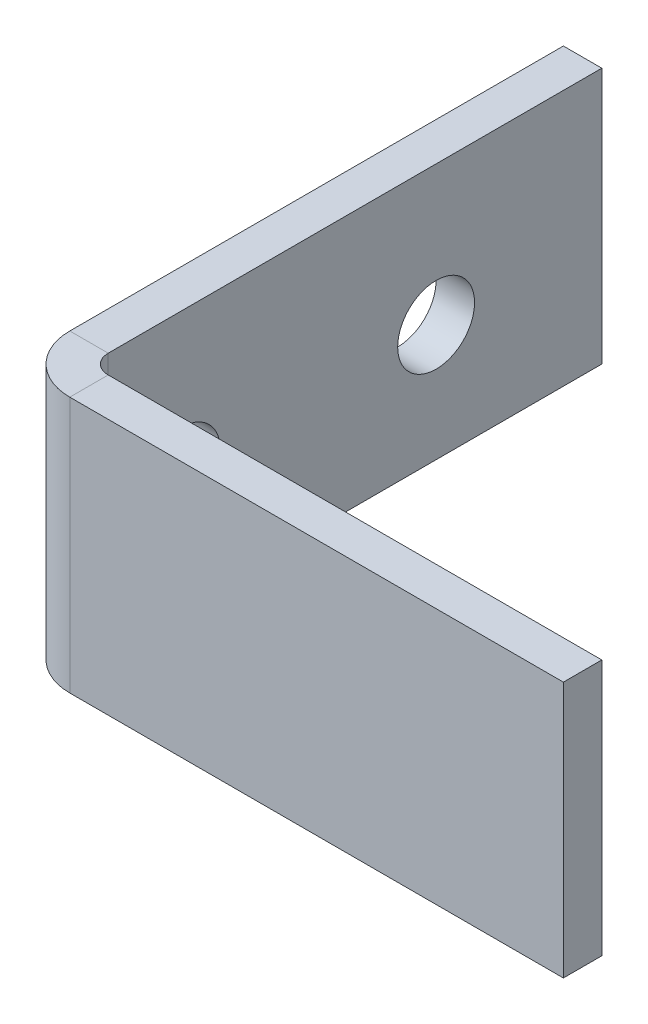
ISO-10303-21;
HEADER;
FILE_DESCRIPTION(('STEP AP214'),'2;1');
FILE_NAME('part.step','',(''),(''),'','','');
FILE_SCHEMA(('AUTOMOTIVE_DESIGN { 1 0 10303 214 1 1 1 1 }'));
ENDSEC;
DATA;
#1=APPLICATION_CONTEXT('core data for automotive mechanical design processes');
#2=APPLICATION_PROTOCOL_DEFINITION('international standard','automotive_design',2000,#1);
#3=PRODUCT_CONTEXT('',#1,'mechanical');
#4=PRODUCT('Part','Part','',(#3));
#5=PRODUCT_RELATED_PRODUCT_CATEGORY('part','',(#4));
#6=PRODUCT_DEFINITION_FORMATION('','',#4);
#7=PRODUCT_DEFINITION_CONTEXT('part definition',#1,'design');
#8=PRODUCT_DEFINITION('design','',#6,#7);
#9=PRODUCT_DEFINITION_SHAPE('','',#8);
#10=(LENGTH_UNIT() NAMED_UNIT(*) SI_UNIT(.MILLI.,.METRE.));
#11=(NAMED_UNIT(*) PLANE_ANGLE_UNIT() SI_UNIT($,.RADIAN.));
#12=(NAMED_UNIT(*) SI_UNIT($,.STERADIAN.) SOLID_ANGLE_UNIT());
#13=UNCERTAINTY_MEASURE_WITH_UNIT(LENGTH_MEASURE(1.E-05),#10,'distance_accuracy_value','');
#14=(GEOMETRIC_REPRESENTATION_CONTEXT(3) GLOBAL_UNCERTAINTY_ASSIGNED_CONTEXT((#13)) GLOBAL_UNIT_ASSIGNED_CONTEXT((#10,
#11,#12)) REPRESENTATION_CONTEXT('',''));
#15=CARTESIAN_POINT('',(0.,0.,0.));
#16=DIRECTION('',(0.,0.,1.));
#17=DIRECTION('',(1.,0.,0.));
#18=AXIS2_PLACEMENT_3D('',#15,#16,#17);
#19=CARTESIAN_POINT('',(-1.5,10.,0.));
#20=DIRECTION('',(1.,0.,0.));
#21=DIRECTION('',(0.,0.,-1.));
#22=AXIS2_PLACEMENT_3D('',#19,#20,#21);
#23=PLANE('',#22);
#24=CARTESIAN_POINT('',(-1.5,4.56076284628182,16.3870233657253));
#25=DIRECTION('',(-1.,0.,0.));
#26=DIRECTION('',(0.,0.,1.));
#27=AXIS2_PLACEMENT_3D('',#24,#25,#26);
#28=CIRCLE('',#27,1.49999999999999);
#29=CARTESIAN_POINT('',(-1.5,4.56076284628182,17.8870233657253));
#30=VERTEX_POINT('',#29);
#31=EDGE_CURVE('E249',#30,#30,#28,.T.);
#32=ORIENTED_EDGE('',*,*,#31,.F.);
#33=EDGE_LOOP('',(#32));
#34=FACE_BOUND('',#33,.T.);
#35=DIRECTION('',(0.,0.,1.));
#36=VECTOR('',#35,1.);
#37=CARTESIAN_POINT('',(-1.5,0.,0.));
#38=LINE('',#37,#36);
#39=CARTESIAN_POINT('',(-1.5,0.,0.));
#40=VERTEX_POINT('',#39);
#41=CARTESIAN_POINT('',(-1.5,0.,19.2634));
#42=VERTEX_POINT('',#41);
#43=EDGE_CURVE('E155',#40,#42,#38,.T.);
#44=ORIENTED_EDGE('',*,*,#43,.T.);
#45=DIRECTION('',(0.,-1.,0.));
#46=VECTOR('',#45,1.);
#47=CARTESIAN_POINT('',(-1.5,10.,19.2634));
#48=LINE('',#47,#46);
#49=CARTESIAN_POINT('',(-1.5,10.,19.2634));
#50=VERTEX_POINT('',#49);
#51=EDGE_CURVE('E118',#50,#42,#48,.T.);
#52=ORIENTED_EDGE('',*,*,#51,.F.);
#53=DIRECTION('',(0.,0.,1.));
#54=VECTOR('',#53,1.);
#55=CARTESIAN_POINT('',(-1.5,10.,0.));
#56=LINE('',#55,#54);
#57=CARTESIAN_POINT('',(-1.5,10.,0.));
#58=VERTEX_POINT('',#57);
#59=EDGE_CURVE('E122',#58,#50,#56,.T.);
#60=ORIENTED_EDGE('',*,*,#59,.F.);
#61=DIRECTION('',(0.,-1.,0.));
#62=VECTOR('',#61,1.);
#63=CARTESIAN_POINT('',(-1.5,10.,0.));
#64=LINE('',#63,#62);
#65=EDGE_CURVE('E109',#58,#40,#64,.T.);
#66=ORIENTED_EDGE('',*,*,#65,.T.);
#67=EDGE_LOOP('',(#44,#52,#60,#66));
#68=FACE_BOUND('',#67,.T.);
#69=CARTESIAN_POINT('',(-1.5,4.56076284628182,6.46670351632039));
#70=DIRECTION('',(-1.,0.,0.));
#71=DIRECTION('',(0.,0.,1.));
#72=AXIS2_PLACEMENT_3D('',#69,#70,#71);
#73=CIRCLE('',#72,1.49999999999999);
#74=CARTESIAN_POINT('',(-1.5,4.56076284628182,7.96670351632038));
#75=VERTEX_POINT('',#74);
#76=EDGE_CURVE('E243',#75,#75,#73,.T.);
#77=ORIENTED_EDGE('',*,*,#76,.F.);
#78=EDGE_LOOP('',(#77));
#79=FACE_BOUND('',#78,.T.);
#80=ADVANCED_FACE('F36',(#34,#68,#79),#23,.F.);
#81=CARTESIAN_POINT('',(0.736600000000002,10.,20.));
#82=DIRECTION('',(0.,1.,0.));
#83=DIRECTION('',(0.,0.,1.));
#84=AXIS2_PLACEMENT_3D('',#81,#82,#83);
#85=PLANE('',#84);
#86=DIRECTION('',(0.,0.,1.));
#87=VECTOR('',#86,1.);
#88=CARTESIAN_POINT('',(0.736600000000002,10.,20.));
#89=LINE('',#88,#87);
#90=CARTESIAN_POINT('',(0.736600000000002,10.,20.));
#91=VERTEX_POINT('',#90);
#92=CARTESIAN_POINT('',(0.736600000000002,10.,21.5));
#93=VERTEX_POINT('',#92);
#94=EDGE_CURVE('E11',#91,#93,#89,.T.);
#95=ORIENTED_EDGE('',*,*,#94,.F.);
#96=CARTESIAN_POINT('',(0.736600000000002,10.,19.2634));
#97=DIRECTION('',(0.,-1.,0.));
#98=DIRECTION('',(0.,0.,-1.));
#99=AXIS2_PLACEMENT_3D('',#96,#97,#98);
#100=CIRCLE('',#99,0.7366);
#101=CARTESIAN_POINT('',(0.,10.,19.2634));
#102=VERTEX_POINT('',#101);
#103=EDGE_CURVE('E134',#102,#91,#100,.F.);
#104=ORIENTED_EDGE('',*,*,#103,.F.);
#105=DIRECTION('',(1.,0.,0.));
#106=VECTOR('',#105,1.);
#107=CARTESIAN_POINT('',(-1.5,10.,19.2634));
#108=LINE('',#107,#106);
#109=EDGE_CURVE('E45',#50,#102,#108,.T.);
#110=ORIENTED_EDGE('',*,*,#109,.F.);
#111=CARTESIAN_POINT('',(0.736600000000002,10.,19.2634));
#112=DIRECTION('',(0.,1.,0.));
#113=DIRECTION('',(1.,0.,0.));
#114=AXIS2_PLACEMENT_3D('',#111,#112,#113);
#115=CIRCLE('',#114,2.2366);
#116=EDGE_CURVE('E127',#50,#93,#115,.T.);
#117=ORIENTED_EDGE('',*,*,#116,.T.);
#118=EDGE_LOOP('',(#95,#104,#110,#117));
#119=FACE_BOUND('',#118,.T.);
#120=ADVANCED_FACE('F38',(#119),#85,.T.);
#121=CARTESIAN_POINT('',(-1.5,10.,19.2634));
#122=DIRECTION('',(0.,1.,0.));
#123=DIRECTION('',(0.,0.,1.));
#124=AXIS2_PLACEMENT_3D('',#121,#122,#123);
#125=PLANE('',#124);
#126=DIRECTION('',(1.,0.,0.));
#127=VECTOR('',#126,1.);
#128=CARTESIAN_POINT('',(0.,10.,20.));
#129=LINE('',#128,#127);
#130=CARTESIAN_POINT('',(20.,10.,20.));
#131=VERTEX_POINT('',#130);
#132=EDGE_CURVE('E184',#91,#131,#129,.T.);
#133=ORIENTED_EDGE('',*,*,#132,.F.);
#134=ORIENTED_EDGE('',*,*,#94,.T.);
#135=DIRECTION('',(1.,0.,0.));
#136=VECTOR('',#135,1.);
#137=CARTESIAN_POINT('',(0.,10.,21.5));
#138=LINE('',#137,#136);
#139=CARTESIAN_POINT('',(20.,10.,21.5));
#140=VERTEX_POINT('',#139);
#141=EDGE_CURVE('E93',#93,#140,#138,.T.);
#142=ORIENTED_EDGE('',*,*,#141,.T.);
#143=DIRECTION('',(0.,0.,1.));
#144=VECTOR('',#143,1.);
#145=CARTESIAN_POINT('',(20.,10.,20.));
#146=LINE('',#145,#144);
#147=EDGE_CURVE('E235',#131,#140,#146,.T.);
#148=ORIENTED_EDGE('',*,*,#147,.F.);
#149=EDGE_LOOP('',(#133,#134,#142,#148));
#150=FACE_BOUND('',#149,.T.);
#151=ADVANCED_FACE('F192',(#150),#125,.T.);
#152=CARTESIAN_POINT('',(0.,0.,19.2634));
#153=DIRECTION('',(0.,-1.,0.));
#154=DIRECTION('',(0.,0.,-1.));
#155=AXIS2_PLACEMENT_3D('',#152,#153,#154);
#156=PLANE('',#155);
#157=DIRECTION('',(-1.,0.,0.));
#158=VECTOR('',#157,1.);
#159=CARTESIAN_POINT('',(0.,0.,19.2634));
#160=LINE('',#159,#158);
#161=CARTESIAN_POINT('',(0.,0.,19.2634));
#162=VERTEX_POINT('',#161);
#163=EDGE_CURVE('E80',#162,#42,#160,.T.);
#164=ORIENTED_EDGE('',*,*,#163,.F.);
#165=CARTESIAN_POINT('',(0.736600000000002,0.,19.2634));
#166=DIRECTION('',(0.,-1.,0.));
#167=DIRECTION('',(0.,0.,-1.));
#168=AXIS2_PLACEMENT_3D('',#165,#166,#167);
#169=CIRCLE('',#168,0.7366);
#170=CARTESIAN_POINT('',(0.736600000000002,0.,20.));
#171=VERTEX_POINT('',#170);
#172=EDGE_CURVE('E150',#162,#171,#169,.F.);
#173=ORIENTED_EDGE('',*,*,#172,.T.);
#174=DIRECTION('',(0.,0.,-1.));
#175=VECTOR('',#174,1.);
#176=CARTESIAN_POINT('',(0.736600000000002,0.,21.5));
#177=LINE('',#176,#175);
#178=CARTESIAN_POINT('',(0.736600000000002,0.,21.5));
#179=VERTEX_POINT('',#178);
#180=EDGE_CURVE('E87',#179,#171,#177,.T.);
#181=ORIENTED_EDGE('',*,*,#180,.F.);
#182=CARTESIAN_POINT('',(0.736600000000002,0.,19.2634));
#183=DIRECTION('',(0.,1.,0.));
#184=DIRECTION('',(1.,0.,0.));
#185=AXIS2_PLACEMENT_3D('',#182,#183,#184);
#186=CIRCLE('',#185,2.2366);
#187=EDGE_CURVE('E157',#42,#179,#186,.T.);
#188=ORIENTED_EDGE('',*,*,#187,.F.);
#189=EDGE_LOOP('',(#164,#173,#181,#188));
#190=FACE_BOUND('',#189,.T.);
#191=ADVANCED_FACE('F190',(#190),#156,.T.);
#192=CARTESIAN_POINT('',(0.736600000000002,0.,21.5));
#193=DIRECTION('',(0.,-1.,0.));
#194=DIRECTION('',(0.,0.,-1.));
#195=AXIS2_PLACEMENT_3D('',#192,#193,#194);
#196=PLANE('',#195);
#197=DIRECTION('',(0.,0.,1.));
#198=VECTOR('',#197,1.);
#199=CARTESIAN_POINT('',(0.,0.,0.));
#200=LINE('',#199,#198);
#201=CARTESIAN_POINT('',(0.,0.,0.));
#202=VERTEX_POINT('',#201);
#203=EDGE_CURVE('E152',#202,#162,#200,.T.);
#204=ORIENTED_EDGE('',*,*,#203,.T.);
#205=ORIENTED_EDGE('',*,*,#163,.T.);
#206=ORIENTED_EDGE('',*,*,#43,.F.);
#207=DIRECTION('',(1.,0.,0.));
#208=VECTOR('',#207,1.);
#209=CARTESIAN_POINT('',(-1.5,0.,0.));
#210=LINE('',#209,#208);
#211=EDGE_CURVE('E115',#40,#202,#210,.T.);
#212=ORIENTED_EDGE('',*,*,#211,.T.);
#213=EDGE_LOOP('',(#204,#205,#206,#212));
#214=FACE_BOUND('',#213,.T.);
#215=ADVANCED_FACE('F186',(#214),#196,.T.);
#216=CARTESIAN_POINT('',(0.,10.,21.5));
#217=DIRECTION('',(0.,0.,-1.));
#218=DIRECTION('',(-1.,0.,0.));
#219=AXIS2_PLACEMENT_3D('',#216,#217,#218);
#220=PLANE('',#219);
#221=DIRECTION('',(1.,0.,0.));
#222=VECTOR('',#221,1.);
#223=CARTESIAN_POINT('',(0.,0.,21.5));
#224=LINE('',#223,#222);
#225=CARTESIAN_POINT('',(20.,0.,21.5));
#226=VERTEX_POINT('',#225);
#227=EDGE_CURVE('E140',#179,#226,#224,.T.);
#228=ORIENTED_EDGE('',*,*,#227,.T.);
#229=DIRECTION('',(0.,-1.,0.));
#230=VECTOR('',#229,1.);
#231=CARTESIAN_POINT('',(20.,10.,21.5));
#232=LINE('',#231,#230);
#233=EDGE_CURVE('E171',#140,#226,#232,.T.);
#234=ORIENTED_EDGE('',*,*,#233,.F.);
#235=ORIENTED_EDGE('',*,*,#141,.F.);
#236=DIRECTION('',(0.,-1.,0.));
#237=VECTOR('',#236,1.);
#238=CARTESIAN_POINT('',(0.736600000000002,10.,21.5));
#239=LINE('',#238,#237);
#240=EDGE_CURVE('E139',#93,#179,#239,.T.);
#241=ORIENTED_EDGE('',*,*,#240,.T.);
#242=EDGE_LOOP('',(#228,#234,#235,#241));
#243=FACE_BOUND('',#242,.T.);
#244=ADVANCED_FACE('F198',(#243),#220,.F.);
#245=CARTESIAN_POINT('',(20.,10.,20.));
#246=DIRECTION('',(1.,0.,0.));
#247=DIRECTION('',(0.,0.,-1.));
#248=AXIS2_PLACEMENT_3D('',#245,#246,#247);
#249=PLANE('',#248);
#250=DIRECTION('',(0.,0.,1.));
#251=VECTOR('',#250,1.);
#252=CARTESIAN_POINT('',(20.,0.,20.));
#253=LINE('',#252,#251);
#254=CARTESIAN_POINT('',(20.,0.,20.));
#255=VERTEX_POINT('',#254);
#256=EDGE_CURVE('E143',#255,#226,#253,.T.);
#257=ORIENTED_EDGE('',*,*,#256,.F.);
#258=DIRECTION('',(0.,-1.,0.));
#259=VECTOR('',#258,1.);
#260=CARTESIAN_POINT('',(20.,10.,20.));
#261=LINE('',#260,#259);
#262=EDGE_CURVE('E169',#131,#255,#261,.T.);
#263=ORIENTED_EDGE('',*,*,#262,.F.);
#264=ORIENTED_EDGE('',*,*,#147,.T.);
#265=ORIENTED_EDGE('',*,*,#233,.T.);
#266=EDGE_LOOP('',(#257,#263,#264,#265));
#267=FACE_BOUND('',#266,.T.);
#268=ADVANCED_FACE('F220',(#267),#249,.T.);
#269=CARTESIAN_POINT('',(0.,10.,20.));
#270=DIRECTION('',(0.,0.,-1.));
#271=DIRECTION('',(-1.,0.,0.));
#272=AXIS2_PLACEMENT_3D('',#269,#270,#271);
#273=PLANE('',#272);
#274=DIRECTION('',(1.,0.,0.));
#275=VECTOR('',#274,1.);
#276=CARTESIAN_POINT('',(0.,0.,20.));
#277=LINE('',#276,#275);
#278=EDGE_CURVE('E147',#171,#255,#277,.T.);
#279=ORIENTED_EDGE('',*,*,#278,.F.);
#280=DIRECTION('',(0.,-1.,0.));
#281=VECTOR('',#280,1.);
#282=CARTESIAN_POINT('',(0.736600000000002,10.,20.));
#283=LINE('',#282,#281);
#284=EDGE_CURVE('E166',#91,#171,#283,.T.);
#285=ORIENTED_EDGE('',*,*,#284,.F.);
#286=ORIENTED_EDGE('',*,*,#132,.T.);
#287=ORIENTED_EDGE('',*,*,#262,.T.);
#288=EDGE_LOOP('',(#279,#285,#286,#287));
#289=FACE_BOUND('',#288,.T.);
#290=ADVANCED_FACE('F217',(#289),#273,.T.);
#291=CARTESIAN_POINT('',(0.736600000000002,10.,19.2634));
#292=DIRECTION('',(0.,-1.,0.));
#293=DIRECTION('',(0.,0.,-1.));
#294=AXIS2_PLACEMENT_3D('',#291,#292,#293);
#295=CYLINDRICAL_SURFACE('',#294,0.7366);
#296=ORIENTED_EDGE('',*,*,#172,.F.);
#297=DIRECTION('',(0.,-1.,0.));
#298=VECTOR('',#297,1.);
#299=CARTESIAN_POINT('',(0.,10.,19.2634));
#300=LINE('',#299,#298);
#301=EDGE_CURVE('E163',#102,#162,#300,.T.);
#302=ORIENTED_EDGE('',*,*,#301,.F.);
#303=ORIENTED_EDGE('',*,*,#103,.T.);
#304=ORIENTED_EDGE('',*,*,#284,.T.);
#305=EDGE_LOOP('',(#296,#302,#303,#304));
#306=FACE_BOUND('',#305,.T.);
#307=ADVANCED_FACE('F180',(#306),#295,.F.);
#308=CARTESIAN_POINT('',(0.,10.,0.));
#309=DIRECTION('',(1.,0.,0.));
#310=DIRECTION('',(0.,0.,-1.));
#311=AXIS2_PLACEMENT_3D('',#308,#309,#310);
#312=PLANE('',#311);
#313=CARTESIAN_POINT('',(0.,4.56076284628182,16.3870233657253));
#314=DIRECTION('',(1.,0.,0.));
#315=DIRECTION('',(0.,0.,-1.));
#316=AXIS2_PLACEMENT_3D('',#313,#314,#315);
#317=CIRCLE('',#316,1.49999999999999);
#318=CARTESIAN_POINT('',(0.,4.56076284628182,14.8870233657253));
#319=VERTEX_POINT('',#318);
#320=EDGE_CURVE('E246',#319,#319,#317,.T.);
#321=ORIENTED_EDGE('',*,*,#320,.F.);
#322=EDGE_LOOP('',(#321));
#323=FACE_BOUND('',#322,.T.);
#324=CARTESIAN_POINT('',(0.,4.56076284628182,6.46670351632039));
#325=DIRECTION('',(1.,0.,0.));
#326=DIRECTION('',(0.,0.,-1.));
#327=AXIS2_PLACEMENT_3D('',#324,#325,#326);
#328=CIRCLE('',#327,1.49999999999999);
#329=CARTESIAN_POINT('',(0.,4.56076284628182,4.9667035163204));
#330=VERTEX_POINT('',#329);
#331=EDGE_CURVE('E144',#330,#330,#328,.T.);
#332=ORIENTED_EDGE('',*,*,#331,.F.);
#333=EDGE_LOOP('',(#332));
#334=FACE_BOUND('',#333,.T.);
#335=ORIENTED_EDGE('',*,*,#203,.F.);
#336=DIRECTION('',(0.,-1.,0.));
#337=VECTOR('',#336,1.);
#338=CARTESIAN_POINT('',(0.,10.,0.));
#339=LINE('',#338,#337);
#340=CARTESIAN_POINT('',(0.,10.,0.));
#341=VERTEX_POINT('',#340);
#342=EDGE_CURVE('E117',#341,#202,#339,.T.);
#343=ORIENTED_EDGE('',*,*,#342,.F.);
#344=DIRECTION('',(0.,0.,1.));
#345=VECTOR('',#344,1.);
#346=CARTESIAN_POINT('',(0.,10.,0.));
#347=LINE('',#346,#345);
#348=EDGE_CURVE('E132',#341,#102,#347,.T.);
#349=ORIENTED_EDGE('',*,*,#348,.T.);
#350=ORIENTED_EDGE('',*,*,#301,.T.);
#351=EDGE_LOOP('',(#335,#343,#349,#350));
#352=FACE_BOUND('',#351,.T.);
#353=ADVANCED_FACE('F185',(#323,#334,#352),#312,.T.);
#354=CARTESIAN_POINT('',(-1.5,10.,0.));
#355=DIRECTION('',(0.,0.,-1.));
#356=DIRECTION('',(-1.,0.,0.));
#357=AXIS2_PLACEMENT_3D('',#354,#355,#356);
#358=PLANE('',#357);
#359=ORIENTED_EDGE('',*,*,#211,.F.);
#360=ORIENTED_EDGE('',*,*,#65,.F.);
#361=DIRECTION('',(1.,0.,0.));
#362=VECTOR('',#361,1.);
#363=CARTESIAN_POINT('',(-1.5,10.,0.));
#364=LINE('',#363,#362);
#365=EDGE_CURVE('E113',#58,#341,#364,.T.);
#366=ORIENTED_EDGE('',*,*,#365,.T.);
#367=ORIENTED_EDGE('',*,*,#342,.T.);
#368=EDGE_LOOP('',(#359,#360,#366,#367));
#369=FACE_BOUND('',#368,.T.);
#370=ADVANCED_FACE('F111',(#369),#358,.T.);
#371=CARTESIAN_POINT('',(0.736600000000002,10.,19.2634));
#372=DIRECTION('',(0.,-1.,0.));
#373=DIRECTION('',(0.,0.,-1.));
#374=AXIS2_PLACEMENT_3D('',#371,#372,#373);
#375=CYLINDRICAL_SURFACE('',#374,2.2366);
#376=ORIENTED_EDGE('',*,*,#187,.T.);
#377=ORIENTED_EDGE('',*,*,#240,.F.);
#378=ORIENTED_EDGE('',*,*,#116,.F.);
#379=ORIENTED_EDGE('',*,*,#51,.T.);
#380=EDGE_LOOP('',(#376,#377,#378,#379));
#381=FACE_BOUND('',#380,.T.);
#382=ADVANCED_FACE('F188',(#381),#375,.T.);
#383=CARTESIAN_POINT('',(0.736600000000002,10.,19.2634));
#384=DIRECTION('',(0.,-1.,0.));
#385=DIRECTION('',(-1.,0.,0.));
#386=AXIS2_PLACEMENT_3D('',#383,#384,#385);
#387=PLANE('',#386);
#388=ORIENTED_EDGE('',*,*,#59,.T.);
#389=ORIENTED_EDGE('',*,*,#109,.T.);
#390=ORIENTED_EDGE('',*,*,#348,.F.);
#391=ORIENTED_EDGE('',*,*,#365,.F.);
#392=EDGE_LOOP('',(#388,#389,#390,#391));
#393=FACE_BOUND('',#392,.T.);
#394=ADVANCED_FACE('F130',(#393),#387,.F.);
#395=CARTESIAN_POINT('',(0.736600000000002,0.,19.2634));
#396=DIRECTION('',(0.,-1.,0.));
#397=DIRECTION('',(-1.,0.,0.));
#398=AXIS2_PLACEMENT_3D('',#395,#396,#397);
#399=PLANE('',#398);
#400=ORIENTED_EDGE('',*,*,#227,.F.);
#401=ORIENTED_EDGE('',*,*,#180,.T.);
#402=ORIENTED_EDGE('',*,*,#278,.T.);
#403=ORIENTED_EDGE('',*,*,#256,.T.);
#404=EDGE_LOOP('',(#400,#401,#402,#403));
#405=FACE_BOUND('',#404,.T.);
#406=ADVANCED_FACE('F233',(#405),#399,.T.);
#407=CARTESIAN_POINT('',(-1.5,4.56076284628182,6.46670351632039));
#408=DIRECTION('',(-1.,0.,0.));
#409=DIRECTION('',(0.,0.,1.));
#410=AXIS2_PLACEMENT_3D('',#407,#408,#409);
#411=CYLINDRICAL_SURFACE('',#410,1.49999999999999);
#412=ORIENTED_EDGE('',*,*,#76,.T.);
#413=EDGE_LOOP('',(#412));
#414=FACE_BOUND('',#413,.T.);
#415=ORIENTED_EDGE('',*,*,#331,.T.);
#416=EDGE_LOOP('',(#415));
#417=FACE_BOUND('',#416,.T.);
#418=ADVANCED_FACE('F255',(#414,#417),#411,.F.);
#419=CARTESIAN_POINT('',(-1.5,4.56076284628182,16.3870233657253));
#420=DIRECTION('',(-1.,0.,0.));
#421=DIRECTION('',(0.,0.,1.));
#422=AXIS2_PLACEMENT_3D('',#419,#420,#421);
#423=CYLINDRICAL_SURFACE('',#422,1.49999999999999);
#424=ORIENTED_EDGE('',*,*,#31,.T.);
#425=EDGE_LOOP('',(#424));
#426=FACE_BOUND('',#425,.T.);
#427=ORIENTED_EDGE('',*,*,#320,.T.);
#428=EDGE_LOOP('',(#427));
#429=FACE_BOUND('',#428,.T.);
#430=ADVANCED_FACE('F252',(#426,#429),#423,.F.);
#431=CLOSED_SHELL('',(#80,#120,#151,#191,#215,#244,#268,#290,#307,#353,#370,#382,#394,#406,#418,#430));
#432=MANIFOLD_SOLID_BREP('B2',#431);
#433=ADVANCED_BREP_SHAPE_REPRESENTATION('',(#18,#432),#14);
#434=SHAPE_DEFINITION_REPRESENTATION(#9,#433);
ENDSEC;
END-ISO-10303-21;
